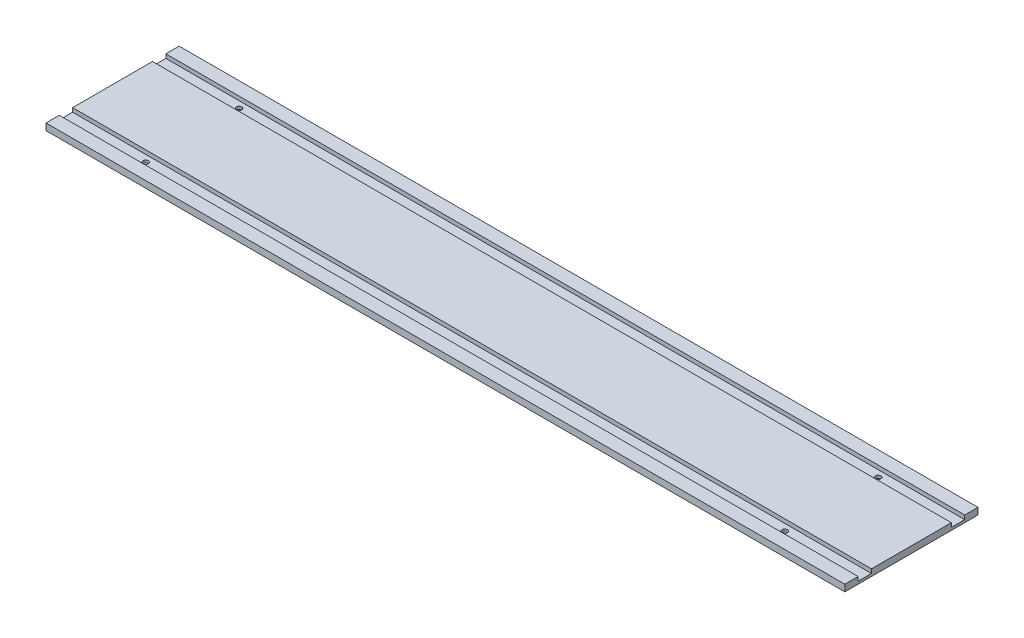
ISO-10303-21;
HEADER;
FILE_DESCRIPTION(('STEP AP214'),'2;1');
FILE_NAME('part.step','',(''),(''),'','','');
FILE_SCHEMA(('AUTOMOTIVE_DESIGN { 1 0 10303 214 1 1 1 1 }'));
ENDSEC;
DATA;
#1=APPLICATION_CONTEXT('core data for automotive mechanical design processes');
#2=APPLICATION_PROTOCOL_DEFINITION('international standard','automotive_design',2000,#1);
#3=PRODUCT_CONTEXT('',#1,'mechanical');
#4=PRODUCT('Part','Part','',(#3));
#5=PRODUCT_RELATED_PRODUCT_CATEGORY('part','',(#4));
#6=PRODUCT_DEFINITION_FORMATION('','',#4);
#7=PRODUCT_DEFINITION_CONTEXT('part definition',#1,'design');
#8=PRODUCT_DEFINITION('design','',#6,#7);
#9=PRODUCT_DEFINITION_SHAPE('','',#8);
#10=(LENGTH_UNIT() NAMED_UNIT(*) SI_UNIT(.MILLI.,.METRE.));
#11=(NAMED_UNIT(*) PLANE_ANGLE_UNIT() SI_UNIT($,.RADIAN.));
#12=(NAMED_UNIT(*) SI_UNIT($,.STERADIAN.) SOLID_ANGLE_UNIT());
#13=UNCERTAINTY_MEASURE_WITH_UNIT(LENGTH_MEASURE(1.E-05),#10,'distance_accuracy_value','');
#14=(GEOMETRIC_REPRESENTATION_CONTEXT(3) GLOBAL_UNCERTAINTY_ASSIGNED_CONTEXT((#13)) GLOBAL_UNIT_ASSIGNED_CONTEXT((#10,
#11,#12)) REPRESENTATION_CONTEXT('',''));
#15=CARTESIAN_POINT('',(0.,0.,0.));
#16=DIRECTION('',(0.,0.,1.));
#17=DIRECTION('',(1.,0.,0.));
#18=AXIS2_PLACEMENT_3D('',#15,#16,#17);
#19=CARTESIAN_POINT('',(600.,5.,-100.));
#20=DIRECTION('',(0.,1.,0.));
#21=DIRECTION('',(-1.,0.,0.));
#22=AXIS2_PLACEMENT_3D('',#19,#20,#21);
#23=PLANE('',#22);
#24=DIRECTION('',(1.,0.,0.));
#25=VECTOR('',#24,1.);
#26=CARTESIAN_POINT('',(0.,4.99999999999994,-80.));
#27=LINE('',#26,#25);
#28=CARTESIAN_POINT('',(0.,4.99999999999994,-80.));
#29=VERTEX_POINT('',#28);
#30=CARTESIAN_POINT('',(600.,5.,-80.));
#31=VERTEX_POINT('',#30);
#32=EDGE_CURVE('E149',#29,#31,#27,.T.);
#33=ORIENTED_EDGE('',*,*,#32,.F.);
#34=DIRECTION('',(0.,0.,1.));
#35=VECTOR('',#34,1.);
#36=CARTESIAN_POINT('',(0.,4.99999999999994,-100.));
#37=LINE('',#36,#35);
#38=CARTESIAN_POINT('',(0.,4.99999999999994,-20.));
#39=VERTEX_POINT('',#38);
#40=EDGE_CURVE('E48',#29,#39,#37,.T.);
#41=ORIENTED_EDGE('',*,*,#40,.T.);
#42=DIRECTION('',(-1.,0.,0.));
#43=VECTOR('',#42,1.);
#44=CARTESIAN_POINT('',(0.,4.99999999999994,-20.));
#45=LINE('',#44,#43);
#46=CARTESIAN_POINT('',(600.,5.,-20.));
#47=VERTEX_POINT('',#46);
#48=EDGE_CURVE('E178',#47,#39,#45,.T.);
#49=ORIENTED_EDGE('',*,*,#48,.F.);
#50=DIRECTION('',(0.,0.,1.));
#51=VECTOR('',#50,1.);
#52=CARTESIAN_POINT('',(600.,5.,-100.));
#53=LINE('',#52,#51);
#54=EDGE_CURVE('E232',#31,#47,#53,.T.);
#55=ORIENTED_EDGE('',*,*,#54,.F.);
#56=EDGE_LOOP('',(#33,#41,#49,#55));
#57=FACE_BOUND('',#56,.T.);
#58=ADVANCED_FACE('F38',(#57),#23,.T.);
#59=DIRECTION('',(-1.,0.,0.));
#60=VECTOR('',#59,1.);
#61=CARTESIAN_POINT('',(0.,4.99999999999994,-90.));
#62=LINE('',#61,#60);
#63=CARTESIAN_POINT('',(600.,5.,-90.));
#64=VERTEX_POINT('',#63);
#65=CARTESIAN_POINT('',(0.,4.99999999999994,-90.));
#66=VERTEX_POINT('',#65);
#67=EDGE_CURVE('E186',#64,#66,#62,.T.);
#68=ORIENTED_EDGE('',*,*,#67,.F.);
#69=CARTESIAN_POINT('',(600.,5.,-100.));
#70=VERTEX_POINT('',#69);
#71=EDGE_CURVE('E154',#70,#64,#53,.T.);
#72=ORIENTED_EDGE('',*,*,#71,.F.);
#73=DIRECTION('',(-1.,0.,0.));
#74=VECTOR('',#73,1.);
#75=CARTESIAN_POINT('',(600.,5.,-100.));
#76=LINE('',#75,#74);
#77=CARTESIAN_POINT('',(0.,4.99999999999994,-100.));
#78=VERTEX_POINT('',#77);
#79=EDGE_CURVE('E209',#70,#78,#76,.T.);
#80=ORIENTED_EDGE('',*,*,#79,.T.);
#81=EDGE_CURVE('E11',#78,#66,#37,.T.);
#82=ORIENTED_EDGE('',*,*,#81,.T.);
#83=EDGE_LOOP('',(#68,#72,#80,#82));
#84=FACE_BOUND('',#83,.T.);
#85=ADVANCED_FACE('F272',(#84),#23,.T.);
#86=CARTESIAN_POINT('',(0.,4.99999999999994,-100.));
#87=DIRECTION('',(-1.,0.,0.));
#88=DIRECTION('',(0.,-1.,0.));
#89=AXIS2_PLACEMENT_3D('',#86,#87,#88);
#90=PLANE('',#89);
#91=DIRECTION('',(0.,1.,0.));
#92=VECTOR('',#91,1.);
#93=CARTESIAN_POINT('',(0.,1.99999999999993,-80.));
#94=LINE('',#93,#92);
#95=CARTESIAN_POINT('',(0.,1.99999999999993,-80.));
#96=VERTEX_POINT('',#95);
#97=EDGE_CURVE('E159',#96,#29,#94,.T.);
#98=ORIENTED_EDGE('',*,*,#97,.F.);
#99=DIRECTION('',(0.,0.,1.));
#100=VECTOR('',#99,1.);
#101=CARTESIAN_POINT('',(0.,1.99999999999993,-90.));
#102=LINE('',#101,#100);
#103=CARTESIAN_POINT('',(0.,1.99999999999993,-90.));
#104=VERTEX_POINT('',#103);
#105=EDGE_CURVE('E141',#104,#96,#102,.T.);
#106=ORIENTED_EDGE('',*,*,#105,.F.);
#107=DIRECTION('',(0.,1.,0.));
#108=VECTOR('',#107,1.);
#109=CARTESIAN_POINT('',(0.,1.99999999999993,-90.));
#110=LINE('',#109,#108);
#111=EDGE_CURVE('E138',#104,#66,#110,.T.);
#112=ORIENTED_EDGE('',*,*,#111,.T.);
#113=ORIENTED_EDGE('',*,*,#81,.F.);
#114=DIRECTION('',(0.,-1.,0.));
#115=VECTOR('',#114,1.);
#116=CARTESIAN_POINT('',(0.,4.99999999999994,-100.));
#117=LINE('',#116,#115);
#118=CARTESIAN_POINT('',(0.,0.,-100.));
#119=VERTEX_POINT('',#118);
#120=EDGE_CURVE('E197',#78,#119,#117,.T.);
#121=ORIENTED_EDGE('',*,*,#120,.T.);
#122=DIRECTION('',(0.,0.,1.));
#123=VECTOR('',#122,1.);
#124=CARTESIAN_POINT('',(0.,0.,-100.));
#125=LINE('',#124,#123);
#126=CARTESIAN_POINT('',(0.,0.,0.));
#127=VERTEX_POINT('',#126);
#128=EDGE_CURVE('E213',#119,#127,#125,.T.);
#129=ORIENTED_EDGE('',*,*,#128,.T.);
#130=DIRECTION('',(0.,-1.,0.));
#131=VECTOR('',#130,1.);
#132=CARTESIAN_POINT('',(0.,4.99999999999994,0.));
#133=LINE('',#132,#131);
#134=CARTESIAN_POINT('',(0.,4.99999999999994,0.));
#135=VERTEX_POINT('',#134);
#136=EDGE_CURVE('E214',#135,#127,#133,.T.);
#137=ORIENTED_EDGE('',*,*,#136,.F.);
#138=CARTESIAN_POINT('',(0.,4.99999999999994,-10.));
#139=VERTEX_POINT('',#138);
#140=EDGE_CURVE('E50',#139,#135,#37,.T.);
#141=ORIENTED_EDGE('',*,*,#140,.F.);
#142=DIRECTION('',(0.,1.,0.));
#143=VECTOR('',#142,1.);
#144=CARTESIAN_POINT('',(0.,1.99999999999993,-10.));
#145=LINE('',#144,#143);
#146=CARTESIAN_POINT('',(0.,1.99999999999993,-10.));
#147=VERTEX_POINT('',#146);
#148=EDGE_CURVE('E191',#147,#139,#145,.T.);
#149=ORIENTED_EDGE('',*,*,#148,.F.);
#150=DIRECTION('',(0.,0.,1.));
#151=VECTOR('',#150,1.);
#152=CARTESIAN_POINT('',(0.,1.99999999999993,-20.));
#153=LINE('',#152,#151);
#154=CARTESIAN_POINT('',(0.,1.99999999999993,-20.));
#155=VERTEX_POINT('',#154);
#156=EDGE_CURVE('E168',#155,#147,#153,.T.);
#157=ORIENTED_EDGE('',*,*,#156,.F.);
#158=DIRECTION('',(0.,1.,0.));
#159=VECTOR('',#158,1.);
#160=CARTESIAN_POINT('',(0.,1.99999999999993,-20.));
#161=LINE('',#160,#159);
#162=EDGE_CURVE('E177',#155,#39,#161,.T.);
#163=ORIENTED_EDGE('',*,*,#162,.T.);
#164=ORIENTED_EDGE('',*,*,#40,.F.);
#165=EDGE_LOOP('',(#98,#106,#112,#113,#121,#129,#137,#141,#149,#157,#163,#164));
#166=FACE_BOUND('',#165,.T.);
#167=ADVANCED_FACE('F40',(#166),#90,.T.);
#168=DIRECTION('',(1.,0.,0.));
#169=VECTOR('',#168,1.);
#170=CARTESIAN_POINT('',(0.,4.99999999999994,-10.));
#171=LINE('',#170,#169);
#172=CARTESIAN_POINT('',(600.,5.,-10.));
#173=VERTEX_POINT('',#172);
#174=EDGE_CURVE('E169',#139,#173,#171,.T.);
#175=ORIENTED_EDGE('',*,*,#174,.F.);
#176=ORIENTED_EDGE('',*,*,#140,.T.);
#177=DIRECTION('',(-1.,0.,0.));
#178=VECTOR('',#177,1.);
#179=CARTESIAN_POINT('',(600.,5.,0.));
#180=LINE('',#179,#178);
#181=CARTESIAN_POINT('',(600.,5.,0.));
#182=VERTEX_POINT('',#181);
#183=EDGE_CURVE('E202',#182,#135,#180,.T.);
#184=ORIENTED_EDGE('',*,*,#183,.F.);
#185=EDGE_CURVE('E233',#173,#182,#53,.T.);
#186=ORIENTED_EDGE('',*,*,#185,.F.);
#187=EDGE_LOOP('',(#175,#176,#184,#186));
#188=FACE_BOUND('',#187,.T.);
#189=ADVANCED_FACE('F275',(#188),#23,.T.);
#190=CARTESIAN_POINT('',(600.,0.,-100.));
#191=DIRECTION('',(1.,0.,0.));
#192=DIRECTION('',(0.,0.,-1.));
#193=AXIS2_PLACEMENT_3D('',#190,#191,#192);
#194=PLANE('',#193);
#195=DIRECTION('',(0.,1.,0.));
#196=VECTOR('',#195,1.);
#197=CARTESIAN_POINT('',(600.,2.,-80.));
#198=LINE('',#197,#196);
#199=CARTESIAN_POINT('',(600.,2.,-80.));
#200=VERTEX_POINT('',#199);
#201=EDGE_CURVE('E219',#200,#31,#198,.T.);
#202=ORIENTED_EDGE('',*,*,#201,.T.);
#203=ORIENTED_EDGE('',*,*,#54,.T.);
#204=DIRECTION('',(0.,1.,0.));
#205=VECTOR('',#204,1.);
#206=CARTESIAN_POINT('',(600.,2.,-20.));
#207=LINE('',#206,#205);
#208=CARTESIAN_POINT('',(600.,2.,-20.));
#209=VERTEX_POINT('',#208);
#210=EDGE_CURVE('E183',#209,#47,#207,.T.);
#211=ORIENTED_EDGE('',*,*,#210,.F.);
#212=DIRECTION('',(0.,0.,-1.));
#213=VECTOR('',#212,1.);
#214=CARTESIAN_POINT('',(600.,2.,-20.));
#215=LINE('',#214,#213);
#216=CARTESIAN_POINT('',(600.,2.,-9.99999999999999));
#217=VERTEX_POINT('',#216);
#218=EDGE_CURVE('E174',#217,#209,#215,.T.);
#219=ORIENTED_EDGE('',*,*,#218,.F.);
#220=DIRECTION('',(0.,1.,0.));
#221=VECTOR('',#220,1.);
#222=CARTESIAN_POINT('',(600.,2.,-10.));
#223=LINE('',#222,#221);
#224=EDGE_CURVE('E187',#217,#173,#223,.T.);
#225=ORIENTED_EDGE('',*,*,#224,.T.);
#226=ORIENTED_EDGE('',*,*,#185,.T.);
#227=DIRECTION('',(0.,1.,0.));
#228=VECTOR('',#227,1.);
#229=CARTESIAN_POINT('',(600.,0.,0.));
#230=LINE('',#229,#228);
#231=CARTESIAN_POINT('',(600.,0.,0.));
#232=VERTEX_POINT('',#231);
#233=EDGE_CURVE('E223',#232,#182,#230,.T.);
#234=ORIENTED_EDGE('',*,*,#233,.F.);
#235=DIRECTION('',(0.,0.,1.));
#236=VECTOR('',#235,1.);
#237=CARTESIAN_POINT('',(600.,0.,-100.));
#238=LINE('',#237,#236);
#239=CARTESIAN_POINT('',(600.,0.,-100.));
#240=VERTEX_POINT('',#239);
#241=EDGE_CURVE('E234',#240,#232,#238,.T.);
#242=ORIENTED_EDGE('',*,*,#241,.F.);
#243=DIRECTION('',(0.,1.,0.));
#244=VECTOR('',#243,1.);
#245=CARTESIAN_POINT('',(600.,0.,-100.));
#246=LINE('',#245,#244);
#247=EDGE_CURVE('E206',#240,#70,#246,.T.);
#248=ORIENTED_EDGE('',*,*,#247,.T.);
#249=ORIENTED_EDGE('',*,*,#71,.T.);
#250=DIRECTION('',(0.,1.,0.));
#251=VECTOR('',#250,1.);
#252=CARTESIAN_POINT('',(600.,2.,-90.));
#253=LINE('',#252,#251);
#254=CARTESIAN_POINT('',(600.,2.,-90.));
#255=VERTEX_POINT('',#254);
#256=EDGE_CURVE('E135',#255,#64,#253,.T.);
#257=ORIENTED_EDGE('',*,*,#256,.F.);
#258=DIRECTION('',(0.,0.,-1.));
#259=VECTOR('',#258,1.);
#260=CARTESIAN_POINT('',(600.,2.,-90.));
#261=LINE('',#260,#259);
#262=EDGE_CURVE('E142',#200,#255,#261,.T.);
#263=ORIENTED_EDGE('',*,*,#262,.F.);
#264=EDGE_LOOP('',(#202,#203,#211,#219,#225,#226,#234,#242,#248,#249,#257,#263));
#265=FACE_BOUND('',#264,.T.);
#266=ADVANCED_FACE('F152',(#265),#194,.T.);
#267=CARTESIAN_POINT('',(0.,0.,-100.));
#268=DIRECTION('',(0.,-1.,0.));
#269=DIRECTION('',(0.,0.,-1.));
#270=AXIS2_PLACEMENT_3D('',#267,#268,#269);
#271=PLANE('',#270);
#272=CARTESIAN_POINT('',(60.,0.,-15.));
#273=DIRECTION('',(0.,1.,0.));
#274=DIRECTION('',(-1.,0.,0.));
#275=AXIS2_PLACEMENT_3D('',#272,#273,#274);
#276=CIRCLE('',#275,2.);
#277=CARTESIAN_POINT('',(58.,0.,-15.));
#278=VERTEX_POINT('',#277);
#279=EDGE_CURVE('E429',#278,#278,#276,.T.);
#280=ORIENTED_EDGE('',*,*,#279,.T.);
#281=EDGE_LOOP('',(#280));
#282=FACE_BOUND('',#281,.T.);
#283=CARTESIAN_POINT('',(540.,0.,-85.));
#284=DIRECTION('',(0.,1.,0.));
#285=DIRECTION('',(-1.,0.,0.));
#286=AXIS2_PLACEMENT_3D('',#283,#284,#285);
#287=CIRCLE('',#286,2.);
#288=CARTESIAN_POINT('',(538.,0.,-85.));
#289=VERTEX_POINT('',#288);
#290=EDGE_CURVE('E426',#289,#289,#287,.T.);
#291=ORIENTED_EDGE('',*,*,#290,.T.);
#292=EDGE_LOOP('',(#291));
#293=FACE_BOUND('',#292,.T.);
#294=CARTESIAN_POINT('',(540.,0.,-15.));
#295=DIRECTION('',(0.,1.,0.));
#296=DIRECTION('',(-1.,0.,0.));
#297=AXIS2_PLACEMENT_3D('',#294,#295,#296);
#298=CIRCLE('',#297,2.);
#299=CARTESIAN_POINT('',(538.,0.,-15.));
#300=VERTEX_POINT('',#299);
#301=EDGE_CURVE('E430',#300,#300,#298,.T.);
#302=ORIENTED_EDGE('',*,*,#301,.T.);
#303=EDGE_LOOP('',(#302));
#304=FACE_BOUND('',#303,.T.);
#305=CARTESIAN_POINT('',(60.,0.,-85.));
#306=DIRECTION('',(0.,1.,0.));
#307=DIRECTION('',(-1.,0.,0.));
#308=AXIS2_PLACEMENT_3D('',#305,#306,#307);
#309=CIRCLE('',#308,2.);
#310=CARTESIAN_POINT('',(58.,0.,-85.));
#311=VERTEX_POINT('',#310);
#312=EDGE_CURVE('E244',#311,#311,#309,.T.);
#313=ORIENTED_EDGE('',*,*,#312,.T.);
#314=EDGE_LOOP('',(#313));
#315=FACE_BOUND('',#314,.T.);
#316=DIRECTION('',(1.,0.,0.));
#317=VECTOR('',#316,1.);
#318=CARTESIAN_POINT('',(0.,0.,0.));
#319=LINE('',#318,#317);
#320=EDGE_CURVE('E218',#127,#232,#319,.T.);
#321=ORIENTED_EDGE('',*,*,#320,.F.);
#322=ORIENTED_EDGE('',*,*,#128,.F.);
#323=DIRECTION('',(1.,0.,0.));
#324=VECTOR('',#323,1.);
#325=CARTESIAN_POINT('',(0.,0.,-100.));
#326=LINE('',#325,#324);
#327=EDGE_CURVE('E201',#119,#240,#326,.T.);
#328=ORIENTED_EDGE('',*,*,#327,.T.);
#329=ORIENTED_EDGE('',*,*,#241,.T.);
#330=EDGE_LOOP('',(#321,#322,#328,#329));
#331=FACE_BOUND('',#330,.T.);
#332=ADVANCED_FACE('F290',(#282,#293,#304,#315,#331),#271,.T.);
#333=CARTESIAN_POINT('',(0.,0.,-100.));
#334=DIRECTION('',(0.,0.,1.));
#335=DIRECTION('',(1.,0.,0.));
#336=AXIS2_PLACEMENT_3D('',#333,#334,#335);
#337=PLANE('',#336);
#338=ORIENTED_EDGE('',*,*,#120,.F.);
#339=ORIENTED_EDGE('',*,*,#79,.F.);
#340=ORIENTED_EDGE('',*,*,#247,.F.);
#341=ORIENTED_EDGE('',*,*,#327,.F.);
#342=EDGE_LOOP('',(#338,#339,#340,#341));
#343=FACE_BOUND('',#342,.T.);
#344=ADVANCED_FACE('F324',(#343),#337,.F.);
#345=CARTESIAN_POINT('',(0.,0.,0.));
#346=DIRECTION('',(0.,0.,1.));
#347=DIRECTION('',(1.,0.,0.));
#348=AXIS2_PLACEMENT_3D('',#345,#346,#347);
#349=PLANE('',#348);
#350=ORIENTED_EDGE('',*,*,#136,.T.);
#351=ORIENTED_EDGE('',*,*,#320,.T.);
#352=ORIENTED_EDGE('',*,*,#233,.T.);
#353=ORIENTED_EDGE('',*,*,#183,.T.);
#354=EDGE_LOOP('',(#350,#351,#352,#353));
#355=FACE_BOUND('',#354,.T.);
#356=ADVANCED_FACE('F316',(#355),#349,.T.);
#357=CARTESIAN_POINT('',(0.,1.99999999999993,-20.));
#358=DIRECTION('',(0.,0.,-1.));
#359=DIRECTION('',(-1.,0.,0.));
#360=AXIS2_PLACEMENT_3D('',#357,#358,#359);
#361=PLANE('',#360);
#362=ORIENTED_EDGE('',*,*,#48,.T.);
#363=ORIENTED_EDGE('',*,*,#162,.F.);
#364=DIRECTION('',(-1.,0.,0.));
#365=VECTOR('',#364,1.);
#366=CARTESIAN_POINT('',(0.,1.99999999999993,-20.));
#367=LINE('',#366,#365);
#368=EDGE_CURVE('E164',#209,#155,#367,.T.);
#369=ORIENTED_EDGE('',*,*,#368,.F.);
#370=ORIENTED_EDGE('',*,*,#210,.T.);
#371=EDGE_LOOP('',(#362,#363,#369,#370));
#372=FACE_BOUND('',#371,.T.);
#373=ADVANCED_FACE('F309',(#372),#361,.F.);
#374=CARTESIAN_POINT('',(0.,1.99999999999993,-10.));
#375=DIRECTION('',(0.,0.,1.));
#376=DIRECTION('',(1.,0.,0.));
#377=AXIS2_PLACEMENT_3D('',#374,#375,#376);
#378=PLANE('',#377);
#379=ORIENTED_EDGE('',*,*,#174,.T.);
#380=ORIENTED_EDGE('',*,*,#224,.F.);
#381=DIRECTION('',(1.,0.,0.));
#382=VECTOR('',#381,1.);
#383=CARTESIAN_POINT('',(0.,1.99999999999993,-10.));
#384=LINE('',#383,#382);
#385=EDGE_CURVE('E65',#147,#217,#384,.T.);
#386=ORIENTED_EDGE('',*,*,#385,.F.);
#387=ORIENTED_EDGE('',*,*,#148,.T.);
#388=EDGE_LOOP('',(#379,#380,#386,#387));
#389=FACE_BOUND('',#388,.T.);
#390=ADVANCED_FACE('F342',(#389),#378,.F.);
#391=CARTESIAN_POINT('',(0.,1.99999999999993,0.));
#392=DIRECTION('',(0.,-1.,0.));
#393=DIRECTION('',(1.,0.,0.));
#394=AXIS2_PLACEMENT_3D('',#391,#392,#393);
#395=PLANE('',#394);
#396=CARTESIAN_POINT('',(60.,1.99999999999994,-15.));
#397=DIRECTION('',(0.,-1.,0.));
#398=DIRECTION('',(1.,0.,0.));
#399=AXIS2_PLACEMENT_3D('',#396,#397,#398);
#400=CIRCLE('',#399,2.);
#401=CARTESIAN_POINT('',(58.,1.99999999999994,-15.));
#402=VERTEX_POINT('',#401);
#403=EDGE_CURVE('E42',#402,#402,#400,.T.);
#404=ORIENTED_EDGE('',*,*,#403,.T.);
#405=EDGE_LOOP('',(#404));
#406=FACE_BOUND('',#405,.T.);
#407=CARTESIAN_POINT('',(540.,1.99999999999999,-15.));
#408=DIRECTION('',(0.,-1.,0.));
#409=DIRECTION('',(1.,0.,0.));
#410=AXIS2_PLACEMENT_3D('',#407,#408,#409);
#411=CIRCLE('',#410,2.);
#412=CARTESIAN_POINT('',(538.,1.99999999999999,-15.));
#413=VERTEX_POINT('',#412);
#414=EDGE_CURVE('E247',#413,#413,#411,.T.);
#415=ORIENTED_EDGE('',*,*,#414,.T.);
#416=EDGE_LOOP('',(#415));
#417=FACE_BOUND('',#416,.T.);
#418=ORIENTED_EDGE('',*,*,#368,.T.);
#419=ORIENTED_EDGE('',*,*,#156,.T.);
#420=ORIENTED_EDGE('',*,*,#385,.T.);
#421=ORIENTED_EDGE('',*,*,#218,.T.);
#422=EDGE_LOOP('',(#418,#419,#420,#421));
#423=FACE_BOUND('',#422,.T.);
#424=ADVANCED_FACE('F256',(#406,#417,#423),#395,.F.);
#425=CARTESIAN_POINT('',(0.,1.99999999999993,-80.));
#426=DIRECTION('',(0.,0.,1.));
#427=DIRECTION('',(1.,0.,0.));
#428=AXIS2_PLACEMENT_3D('',#425,#426,#427);
#429=PLANE('',#428);
#430=ORIENTED_EDGE('',*,*,#32,.T.);
#431=ORIENTED_EDGE('',*,*,#201,.F.);
#432=DIRECTION('',(1.,0.,0.));
#433=VECTOR('',#432,1.);
#434=CARTESIAN_POINT('',(0.,1.99999999999993,-80.));
#435=LINE('',#434,#433);
#436=EDGE_CURVE('E57',#96,#200,#435,.T.);
#437=ORIENTED_EDGE('',*,*,#436,.F.);
#438=ORIENTED_EDGE('',*,*,#97,.T.);
#439=EDGE_LOOP('',(#430,#431,#437,#438));
#440=FACE_BOUND('',#439,.T.);
#441=ADVANCED_FACE('F334',(#440),#429,.F.);
#442=CARTESIAN_POINT('',(0.,1.99999999999993,-90.));
#443=DIRECTION('',(0.,0.,-1.));
#444=DIRECTION('',(-1.,0.,0.));
#445=AXIS2_PLACEMENT_3D('',#442,#443,#444);
#446=PLANE('',#445);
#447=ORIENTED_EDGE('',*,*,#67,.T.);
#448=ORIENTED_EDGE('',*,*,#111,.F.);
#449=DIRECTION('',(-1.,0.,0.));
#450=VECTOR('',#449,1.);
#451=CARTESIAN_POINT('',(0.,1.99999999999993,-90.));
#452=LINE('',#451,#450);
#453=EDGE_CURVE('E132',#255,#104,#452,.T.);
#454=ORIENTED_EDGE('',*,*,#453,.F.);
#455=ORIENTED_EDGE('',*,*,#256,.T.);
#456=EDGE_LOOP('',(#447,#448,#454,#455));
#457=FACE_BOUND('',#456,.T.);
#458=ADVANCED_FACE('F133',(#457),#446,.F.);
#459=CARTESIAN_POINT('',(0.,1.99999999999993,0.));
#460=DIRECTION('',(0.,1.,0.));
#461=DIRECTION('',(-1.,0.,0.));
#462=AXIS2_PLACEMENT_3D('',#459,#460,#461);
#463=PLANE('',#462);
#464=CARTESIAN_POINT('',(540.,1.99999999999999,-85.));
#465=DIRECTION('',(0.,1.,0.));
#466=DIRECTION('',(-1.,0.,0.));
#467=AXIS2_PLACEMENT_3D('',#464,#465,#466);
#468=CIRCLE('',#467,2.);
#469=CARTESIAN_POINT('',(538.,1.99999999999999,-85.));
#470=VERTEX_POINT('',#469);
#471=EDGE_CURVE('E243',#470,#470,#468,.T.);
#472=ORIENTED_EDGE('',*,*,#471,.F.);
#473=EDGE_LOOP('',(#472));
#474=FACE_BOUND('',#473,.T.);
#475=CARTESIAN_POINT('',(60.,1.99999999999994,-85.));
#476=DIRECTION('',(0.,1.,0.));
#477=DIRECTION('',(-1.,0.,0.));
#478=AXIS2_PLACEMENT_3D('',#475,#476,#477);
#479=CIRCLE('',#478,2.);
#480=CARTESIAN_POINT('',(58.,1.99999999999994,-85.));
#481=VERTEX_POINT('',#480);
#482=EDGE_CURVE('E239',#481,#481,#479,.T.);
#483=ORIENTED_EDGE('',*,*,#482,.F.);
#484=EDGE_LOOP('',(#483));
#485=FACE_BOUND('',#484,.T.);
#486=ORIENTED_EDGE('',*,*,#262,.T.);
#487=ORIENTED_EDGE('',*,*,#453,.T.);
#488=ORIENTED_EDGE('',*,*,#105,.T.);
#489=ORIENTED_EDGE('',*,*,#436,.T.);
#490=EDGE_LOOP('',(#486,#487,#488,#489));
#491=FACE_BOUND('',#490,.T.);
#492=ADVANCED_FACE('F145',(#474,#485,#491),#463,.T.);
#493=CARTESIAN_POINT('',(60.,0.,-85.));
#494=DIRECTION('',(0.,1.,0.));
#495=DIRECTION('',(-1.,0.,0.));
#496=AXIS2_PLACEMENT_3D('',#493,#494,#495);
#497=CYLINDRICAL_SURFACE('',#496,2.);
#498=CARTESIAN_POINT('',(58.,1.99999999999994,-85.));
#499=CARTESIAN_POINT('',(58.,1.97916666666661,-85.));
#500=CARTESIAN_POINT('',(58.,1.95833333333327,-85.));
#501=CARTESIAN_POINT('',(58.,1.91666666666661,-85.));
#502=CARTESIAN_POINT('',(58.,1.89583333333327,-85.));
#503=CARTESIAN_POINT('',(58.,1.85416666666661,-85.));
#504=CARTESIAN_POINT('',(58.,1.83333333333327,-85.));
#505=CARTESIAN_POINT('',(58.,1.79166666666661,-85.));
#506=CARTESIAN_POINT('',(58.,1.77083333333327,-85.));
#507=CARTESIAN_POINT('',(58.,1.72916666666661,-85.));
#508=CARTESIAN_POINT('',(58.,1.70833333333327,-85.));
#509=CARTESIAN_POINT('',(58.,1.66666666666661,-85.));
#510=CARTESIAN_POINT('',(58.,1.64583333333327,-85.));
#511=CARTESIAN_POINT('',(58.,1.60416666666661,-85.));
#512=CARTESIAN_POINT('',(58.,1.58333333333327,-85.));
#513=CARTESIAN_POINT('',(58.,1.54166666666661,-85.));
#514=CARTESIAN_POINT('',(58.,1.52083333333327,-85.));
#515=CARTESIAN_POINT('',(58.,1.47916666666661,-85.));
#516=CARTESIAN_POINT('',(58.,1.45833333333327,-85.));
#517=CARTESIAN_POINT('',(58.,1.41666666666661,-85.));
#518=CARTESIAN_POINT('',(58.,1.39583333333327,-85.));
#519=CARTESIAN_POINT('',(58.,1.35416666666661,-85.));
#520=CARTESIAN_POINT('',(58.,1.33333333333327,-85.));
#521=CARTESIAN_POINT('',(58.,1.29166666666661,-85.));
#522=CARTESIAN_POINT('',(58.,1.27083333333327,-85.));
#523=CARTESIAN_POINT('',(58.,1.22916666666661,-85.));
#524=CARTESIAN_POINT('',(58.,1.20833333333327,-85.));
#525=CARTESIAN_POINT('',(58.,1.16666666666661,-85.));
#526=CARTESIAN_POINT('',(58.,1.14583333333327,-85.));
#527=CARTESIAN_POINT('',(58.,1.10416666666661,-85.));
#528=CARTESIAN_POINT('',(58.,1.08333333333327,-85.));
#529=CARTESIAN_POINT('',(58.,1.04166666666661,-85.));
#530=CARTESIAN_POINT('',(58.,1.02083333333327,-85.));
#531=CARTESIAN_POINT('',(58.,0.979166666666607,-85.));
#532=CARTESIAN_POINT('',(58.,0.958333333333274,-85.));
#533=CARTESIAN_POINT('',(58.,0.916666666666607,-85.));
#534=CARTESIAN_POINT('',(58.,0.895833333333274,-85.));
#535=CARTESIAN_POINT('',(58.,0.854166666666607,-85.));
#536=CARTESIAN_POINT('',(58.,0.833333333333274,-85.));
#537=CARTESIAN_POINT('',(58.,0.791666666666607,-85.));
#538=CARTESIAN_POINT('',(58.,0.770833333333274,-85.));
#539=CARTESIAN_POINT('',(58.,0.729166666666607,-85.));
#540=CARTESIAN_POINT('',(58.,0.708333333333274,-85.));
#541=CARTESIAN_POINT('',(58.,0.666666666666607,-85.));
#542=CARTESIAN_POINT('',(58.,0.645833333333274,-85.));
#543=CARTESIAN_POINT('',(58.,0.604166666666607,-85.));
#544=CARTESIAN_POINT('',(58.,0.583333333333274,-85.));
#545=CARTESIAN_POINT('',(58.,0.541666666666607,-85.));
#546=CARTESIAN_POINT('',(58.,0.520833333333274,-85.));
#547=CARTESIAN_POINT('',(58.,0.479166666666607,-85.));
#548=CARTESIAN_POINT('',(58.,0.458333333333274,-85.));
#549=CARTESIAN_POINT('',(58.,0.416666666666607,-85.));
#550=CARTESIAN_POINT('',(58.,0.395833333333274,-85.));
#551=CARTESIAN_POINT('',(58.,0.354166666666607,-85.));
#552=CARTESIAN_POINT('',(58.,0.333333333333274,-85.));
#553=CARTESIAN_POINT('',(58.,0.291666666666607,-85.));
#554=CARTESIAN_POINT('',(58.,0.270833333333273,-85.));
#555=CARTESIAN_POINT('',(58.,0.229166666666607,-85.));
#556=CARTESIAN_POINT('',(58.,0.208333333333273,-85.));
#557=CARTESIAN_POINT('',(58.,0.166666666666607,-85.));
#558=CARTESIAN_POINT('',(58.,0.145833333333273,-85.));
#559=CARTESIAN_POINT('',(58.,0.104166666666607,-85.));
#560=CARTESIAN_POINT('',(58.,0.0833333333332733,-85.));
#561=CARTESIAN_POINT('',(58.,0.0416666666666066,-85.));
#562=CARTESIAN_POINT('',(58.,0.0208333333332733,-85.));
#563=CARTESIAN_POINT('',(58.,0.,-85.));
#564=B_SPLINE_CURVE_WITH_KNOTS('',3,(#498,#499,#500,#501,#502,#503,#504,#505,#506,#507,#508,
#509,#510,#511,#512,#513,#514,#515,#516,#517,#518,#519,#520,#521,#522,#523,#524,#525,#526,#527,
#528,#529,#530,#531,#532,#533,#534,#535,#536,#537,#538,#539,#540,#541,#542,#543,#544,#545,#546,
#547,#548,#549,#550,#551,#552,#553,#554,#555,#556,#557,#558,#559,#560,#561,#562,#563),
.UNSPECIFIED.,.F.,.F.,(4,2,2,2,2,2,2,2,2,2,2,2,2,2,2,2,2,2,2,2,2,2,2,2,2,2,2,2,2,2,2,2,4),(0.,
0.0624999999999996,0.125,0.1875,0.25,0.3125,0.375,0.4375,0.5,0.5625,0.625,0.6875,0.75,0.8125,
0.875,0.9375,1.,1.0625,1.125,1.1875,1.25,1.3125,1.375,1.4375,1.5,1.5625,1.625,1.6875,1.75,
1.8125,1.875,1.9375,2.),.UNSPECIFIED.);
#565=EDGE_CURVE('BSEAM391',#481,#311,#564,.T.);
#566=ORIENTED_EDGE('',*,*,#482,.T.);
#567=ORIENTED_EDGE('',*,*,#312,.F.);
#568=ORIENTED_EDGE('',*,*,#565,.T.);
#569=ORIENTED_EDGE('',*,*,#565,.F.);
#570=EDGE_LOOP('',(#566,#568,#567,#569));
#571=FACE_BOUND('',#570,.T.);
#572=ADVANCED_FACE('F391',(#571),#497,.F.);
#573=CARTESIAN_POINT('',(540.,0.,-85.));
#574=DIRECTION('',(0.,1.,0.));
#575=DIRECTION('',(-1.,0.,0.));
#576=AXIS2_PLACEMENT_3D('',#573,#574,#575);
#577=CYLINDRICAL_SURFACE('',#576,2.);
#578=CARTESIAN_POINT('',(538.,1.99999999999999,-85.));
#579=CARTESIAN_POINT('',(538.,1.97916666666666,-85.));
#580=CARTESIAN_POINT('',(538.,1.95833333333333,-85.));
#581=CARTESIAN_POINT('',(538.,1.91666666666666,-85.));
#582=CARTESIAN_POINT('',(538.,1.89583333333333,-85.));
#583=CARTESIAN_POINT('',(538.,1.85416666666666,-85.));
#584=CARTESIAN_POINT('',(538.,1.83333333333333,-85.));
#585=CARTESIAN_POINT('',(538.,1.79166666666666,-85.));
#586=CARTESIAN_POINT('',(538.,1.77083333333333,-85.));
#587=CARTESIAN_POINT('',(538.,1.72916666666666,-85.));
#588=CARTESIAN_POINT('',(538.,1.70833333333333,-85.));
#589=CARTESIAN_POINT('',(538.,1.66666666666666,-85.));
#590=CARTESIAN_POINT('',(538.,1.64583333333333,-85.));
#591=CARTESIAN_POINT('',(538.,1.60416666666666,-85.));
#592=CARTESIAN_POINT('',(538.,1.58333333333333,-85.));
#593=CARTESIAN_POINT('',(538.,1.54166666666666,-85.));
#594=CARTESIAN_POINT('',(538.,1.52083333333333,-85.));
#595=CARTESIAN_POINT('',(538.,1.47916666666666,-85.));
#596=CARTESIAN_POINT('',(538.,1.45833333333333,-85.));
#597=CARTESIAN_POINT('',(538.,1.41666666666666,-85.));
#598=CARTESIAN_POINT('',(538.,1.39583333333333,-85.));
#599=CARTESIAN_POINT('',(538.,1.35416666666666,-85.));
#600=CARTESIAN_POINT('',(538.,1.33333333333333,-85.));
#601=CARTESIAN_POINT('',(538.,1.29166666666666,-85.));
#602=CARTESIAN_POINT('',(538.,1.27083333333333,-85.));
#603=CARTESIAN_POINT('',(538.,1.22916666666666,-85.));
#604=CARTESIAN_POINT('',(538.,1.20833333333333,-85.));
#605=CARTESIAN_POINT('',(538.,1.16666666666666,-85.));
#606=CARTESIAN_POINT('',(538.,1.14583333333333,-85.));
#607=CARTESIAN_POINT('',(538.,1.10416666666666,-85.));
#608=CARTESIAN_POINT('',(538.,1.08333333333333,-85.));
#609=CARTESIAN_POINT('',(538.,1.04166666666666,-85.));
#610=CARTESIAN_POINT('',(538.,1.02083333333333,-85.));
#611=CARTESIAN_POINT('',(538.,0.97916666666666,-85.));
#612=CARTESIAN_POINT('',(538.,0.958333333333326,-85.));
#613=CARTESIAN_POINT('',(538.,0.91666666666666,-85.));
#614=CARTESIAN_POINT('',(538.,0.895833333333326,-85.));
#615=CARTESIAN_POINT('',(538.,0.85416666666666,-85.));
#616=CARTESIAN_POINT('',(538.,0.833333333333326,-85.));
#617=CARTESIAN_POINT('',(538.,0.79166666666666,-85.));
#618=CARTESIAN_POINT('',(538.,0.770833333333326,-85.));
#619=CARTESIAN_POINT('',(538.,0.72916666666666,-85.));
#620=CARTESIAN_POINT('',(538.,0.708333333333326,-85.));
#621=CARTESIAN_POINT('',(538.,0.666666666666659,-85.));
#622=CARTESIAN_POINT('',(538.,0.645833333333326,-85.));
#623=CARTESIAN_POINT('',(538.,0.604166666666659,-85.));
#624=CARTESIAN_POINT('',(538.,0.583333333333326,-85.));
#625=CARTESIAN_POINT('',(538.,0.541666666666659,-85.));
#626=CARTESIAN_POINT('',(538.,0.520833333333326,-85.));
#627=CARTESIAN_POINT('',(538.,0.479166666666659,-85.));
#628=CARTESIAN_POINT('',(538.,0.458333333333326,-85.));
#629=CARTESIAN_POINT('',(538.,0.416666666666659,-85.));
#630=CARTESIAN_POINT('',(538.,0.395833333333326,-85.));
#631=CARTESIAN_POINT('',(538.,0.354166666666659,-85.));
#632=CARTESIAN_POINT('',(538.,0.333333333333326,-85.));
#633=CARTESIAN_POINT('',(538.,0.291666666666659,-85.));
#634=CARTESIAN_POINT('',(538.,0.270833333333326,-85.));
#635=CARTESIAN_POINT('',(538.,0.229166666666659,-85.));
#636=CARTESIAN_POINT('',(538.,0.208333333333325,-85.));
#637=CARTESIAN_POINT('',(538.,0.166666666666659,-85.));
#638=CARTESIAN_POINT('',(538.,0.145833333333325,-85.));
#639=CARTESIAN_POINT('',(538.,0.104166666666659,-85.));
#640=CARTESIAN_POINT('',(538.,0.0833333333333254,-85.));
#641=CARTESIAN_POINT('',(538.,0.0416666666666587,-85.));
#642=CARTESIAN_POINT('',(538.,0.0208333333333253,-85.));
#643=CARTESIAN_POINT('',(538.,0.,-85.));
#644=B_SPLINE_CURVE_WITH_KNOTS('',3,(#578,#579,#580,#581,#582,#583,#584,#585,#586,#587,#588,
#589,#590,#591,#592,#593,#594,#595,#596,#597,#598,#599,#600,#601,#602,#603,#604,#605,#606,#607,
#608,#609,#610,#611,#612,#613,#614,#615,#616,#617,#618,#619,#620,#621,#622,#623,#624,#625,#626,
#627,#628,#629,#630,#631,#632,#633,#634,#635,#636,#637,#638,#639,#640,#641,#642,#643),
.UNSPECIFIED.,.F.,.F.,(4,2,2,2,2,2,2,2,2,2,2,2,2,2,2,2,2,2,2,2,2,2,2,2,2,2,2,2,2,2,2,2,4),(0.,
0.0624999999999996,0.125,0.1875,0.25,0.3125,0.375,0.4375,0.5,0.5625,0.625,0.687500000000001,
0.750000000000001,0.812500000000001,0.875000000000001,0.937500000000001,1.,1.0625,1.125,1.1875,
1.25,1.3125,1.375,1.4375,1.5,1.5625,1.625,1.6875,1.75,1.8125,1.875,1.9375,2.),.UNSPECIFIED.);
#645=EDGE_CURVE('BSEAM266',#470,#289,#644,.T.);
#646=ORIENTED_EDGE('',*,*,#471,.T.);
#647=ORIENTED_EDGE('',*,*,#290,.F.);
#648=ORIENTED_EDGE('',*,*,#645,.T.);
#649=ORIENTED_EDGE('',*,*,#645,.F.);
#650=EDGE_LOOP('',(#646,#648,#647,#649));
#651=FACE_BOUND('',#650,.T.);
#652=ADVANCED_FACE('F266',(#651),#577,.F.);
#653=CARTESIAN_POINT('',(540.,0.,-15.));
#654=DIRECTION('',(0.,1.,0.));
#655=DIRECTION('',(-1.,0.,0.));
#656=AXIS2_PLACEMENT_3D('',#653,#654,#655);
#657=CYLINDRICAL_SURFACE('',#656,2.);
#658=CARTESIAN_POINT('',(538.,0.,-15.));
#659=CARTESIAN_POINT('',(538.,0.0208333333333253,-15.));
#660=CARTESIAN_POINT('',(538.,0.0416666666666587,-15.));
#661=CARTESIAN_POINT('',(538.,0.0833333333333254,-15.));
#662=CARTESIAN_POINT('',(538.,0.104166666666659,-15.));
#663=CARTESIAN_POINT('',(538.,0.145833333333325,-15.));
#664=CARTESIAN_POINT('',(538.,0.166666666666659,-15.));
#665=CARTESIAN_POINT('',(538.,0.208333333333326,-15.));
#666=CARTESIAN_POINT('',(538.,0.229166666666659,-15.));
#667=CARTESIAN_POINT('',(538.,0.270833333333326,-15.));
#668=CARTESIAN_POINT('',(538.,0.291666666666659,-15.));
#669=CARTESIAN_POINT('',(538.,0.333333333333326,-15.));
#670=CARTESIAN_POINT('',(538.,0.354166666666659,-15.));
#671=CARTESIAN_POINT('',(538.,0.395833333333326,-15.));
#672=CARTESIAN_POINT('',(538.,0.416666666666659,-15.));
#673=CARTESIAN_POINT('',(538.,0.458333333333326,-15.));
#674=CARTESIAN_POINT('',(538.,0.479166666666659,-15.));
#675=CARTESIAN_POINT('',(538.,0.520833333333326,-15.));
#676=CARTESIAN_POINT('',(538.,0.541666666666659,-15.));
#677=CARTESIAN_POINT('',(538.,0.583333333333326,-15.));
#678=CARTESIAN_POINT('',(538.,0.604166666666659,-15.));
#679=CARTESIAN_POINT('',(538.,0.645833333333326,-15.));
#680=CARTESIAN_POINT('',(538.,0.666666666666659,-15.));
#681=CARTESIAN_POINT('',(538.,0.708333333333326,-15.));
#682=CARTESIAN_POINT('',(538.,0.72916666666666,-15.));
#683=CARTESIAN_POINT('',(538.,0.770833333333326,-15.));
#684=CARTESIAN_POINT('',(538.,0.79166666666666,-15.));
#685=CARTESIAN_POINT('',(538.,0.833333333333326,-15.));
#686=CARTESIAN_POINT('',(538.,0.85416666666666,-15.));
#687=CARTESIAN_POINT('',(538.,0.895833333333326,-15.));
#688=CARTESIAN_POINT('',(538.,0.91666666666666,-15.));
#689=CARTESIAN_POINT('',(538.,0.958333333333326,-15.));
#690=CARTESIAN_POINT('',(538.,0.97916666666666,-15.));
#691=CARTESIAN_POINT('',(538.,1.02083333333333,-15.));
#692=CARTESIAN_POINT('',(538.,1.04166666666666,-15.));
#693=CARTESIAN_POINT('',(538.,1.08333333333333,-15.));
#694=CARTESIAN_POINT('',(538.,1.10416666666666,-15.));
#695=CARTESIAN_POINT('',(538.,1.14583333333333,-15.));
#696=CARTESIAN_POINT('',(538.,1.16666666666666,-15.));
#697=CARTESIAN_POINT('',(538.,1.20833333333333,-15.));
#698=CARTESIAN_POINT('',(538.,1.22916666666666,-15.));
#699=CARTESIAN_POINT('',(538.,1.27083333333333,-15.));
#700=CARTESIAN_POINT('',(538.,1.29166666666666,-15.));
#701=CARTESIAN_POINT('',(538.,1.33333333333333,-15.));
#702=CARTESIAN_POINT('',(538.,1.35416666666666,-15.));
#703=CARTESIAN_POINT('',(538.,1.39583333333333,-15.));
#704=CARTESIAN_POINT('',(538.,1.41666666666666,-15.));
#705=CARTESIAN_POINT('',(538.,1.45833333333333,-15.));
#706=CARTESIAN_POINT('',(538.,1.47916666666666,-15.));
#707=CARTESIAN_POINT('',(538.,1.52083333333333,-15.));
#708=CARTESIAN_POINT('',(538.,1.54166666666666,-15.));
#709=CARTESIAN_POINT('',(538.,1.58333333333333,-15.));
#710=CARTESIAN_POINT('',(538.,1.60416666666666,-15.));
#711=CARTESIAN_POINT('',(538.,1.64583333333333,-15.));
#712=CARTESIAN_POINT('',(538.,1.66666666666666,-15.));
#713=CARTESIAN_POINT('',(538.,1.70833333333333,-15.));
#714=CARTESIAN_POINT('',(538.,1.72916666666666,-15.));
#715=CARTESIAN_POINT('',(538.,1.77083333333333,-15.));
#716=CARTESIAN_POINT('',(538.,1.79166666666666,-15.));
#717=CARTESIAN_POINT('',(538.,1.83333333333333,-15.));
#718=CARTESIAN_POINT('',(538.,1.85416666666666,-15.));
#719=CARTESIAN_POINT('',(538.,1.89583333333333,-15.));
#720=CARTESIAN_POINT('',(538.,1.91666666666666,-15.));
#721=CARTESIAN_POINT('',(538.,1.95833333333333,-15.));
#722=CARTESIAN_POINT('',(538.,1.97916666666666,-15.));
#723=CARTESIAN_POINT('',(538.,1.99999999999999,-15.));
#724=B_SPLINE_CURVE_WITH_KNOTS('',3,(#658,#659,#660,#661,#662,#663,#664,#665,#666,#667,#668,
#669,#670,#671,#672,#673,#674,#675,#676,#677,#678,#679,#680,#681,#682,#683,#684,#685,#686,#687,
#688,#689,#690,#691,#692,#693,#694,#695,#696,#697,#698,#699,#700,#701,#702,#703,#704,#705,#706,
#707,#708,#709,#710,#711,#712,#713,#714,#715,#716,#717,#718,#719,#720,#721,#722,#723),
.UNSPECIFIED.,.F.,.F.,(4,2,2,2,2,2,2,2,2,2,2,2,2,2,2,2,2,2,2,2,2,2,2,2,2,2,2,2,2,2,2,2,4),(0.,
0.0625000000000001,0.125,0.1875,0.25,0.3125,0.375,0.437500000000001,0.500000000000001,
0.562500000000001,0.625000000000001,0.687500000000001,0.750000000000001,0.812500000000001,
0.875000000000001,0.937500000000001,1.,1.0625,1.125,1.1875,1.25,1.3125,1.375,1.4375,1.5,1.5625,
1.625,1.6875,1.75,1.8125,1.875,1.9375,2.),.UNSPECIFIED.);
#725=EDGE_CURVE('BSEAM260',#300,#413,#724,.T.);
#726=ORIENTED_EDGE('',*,*,#301,.F.);
#727=ORIENTED_EDGE('',*,*,#414,.F.);
#728=ORIENTED_EDGE('',*,*,#725,.T.);
#729=ORIENTED_EDGE('',*,*,#725,.F.);
#730=EDGE_LOOP('',(#726,#728,#727,#729));
#731=FACE_BOUND('',#730,.T.);
#732=ADVANCED_FACE('F260',(#731),#657,.F.);
#733=CARTESIAN_POINT('',(60.,0.,-15.));
#734=DIRECTION('',(0.,1.,0.));
#735=DIRECTION('',(-1.,0.,0.));
#736=AXIS2_PLACEMENT_3D('',#733,#734,#735);
#737=CYLINDRICAL_SURFACE('',#736,2.);
#738=CARTESIAN_POINT('',(58.,0.,-15.));
#739=CARTESIAN_POINT('',(58.,0.0208333333332733,-15.));
#740=CARTESIAN_POINT('',(58.,0.0416666666666066,-15.));
#741=CARTESIAN_POINT('',(58.,0.0833333333332733,-15.));
#742=CARTESIAN_POINT('',(58.,0.104166666666607,-15.));
#743=CARTESIAN_POINT('',(58.,0.145833333333273,-15.));
#744=CARTESIAN_POINT('',(58.,0.166666666666607,-15.));
#745=CARTESIAN_POINT('',(58.,0.208333333333273,-15.));
#746=CARTESIAN_POINT('',(58.,0.229166666666607,-15.));
#747=CARTESIAN_POINT('',(58.,0.270833333333273,-15.));
#748=CARTESIAN_POINT('',(58.,0.291666666666607,-15.));
#749=CARTESIAN_POINT('',(58.,0.333333333333274,-15.));
#750=CARTESIAN_POINT('',(58.,0.354166666666607,-15.));
#751=CARTESIAN_POINT('',(58.,0.395833333333274,-15.));
#752=CARTESIAN_POINT('',(58.,0.416666666666607,-15.));
#753=CARTESIAN_POINT('',(58.,0.458333333333274,-15.));
#754=CARTESIAN_POINT('',(58.,0.479166666666607,-15.));
#755=CARTESIAN_POINT('',(58.,0.520833333333274,-15.));
#756=CARTESIAN_POINT('',(58.,0.541666666666607,-15.));
#757=CARTESIAN_POINT('',(58.,0.583333333333274,-15.));
#758=CARTESIAN_POINT('',(58.,0.604166666666607,-15.));
#759=CARTESIAN_POINT('',(58.,0.645833333333274,-15.));
#760=CARTESIAN_POINT('',(58.,0.666666666666607,-15.));
#761=CARTESIAN_POINT('',(58.,0.708333333333274,-15.));
#762=CARTESIAN_POINT('',(58.,0.729166666666607,-15.));
#763=CARTESIAN_POINT('',(58.,0.770833333333274,-15.));
#764=CARTESIAN_POINT('',(58.,0.791666666666607,-15.));
#765=CARTESIAN_POINT('',(58.,0.833333333333274,-15.));
#766=CARTESIAN_POINT('',(58.,0.854166666666607,-15.));
#767=CARTESIAN_POINT('',(58.,0.895833333333274,-15.));
#768=CARTESIAN_POINT('',(58.,0.916666666666607,-15.));
#769=CARTESIAN_POINT('',(58.,0.958333333333274,-15.));
#770=CARTESIAN_POINT('',(58.,0.979166666666607,-15.));
#771=CARTESIAN_POINT('',(58.,1.02083333333327,-15.));
#772=CARTESIAN_POINT('',(58.,1.04166666666661,-15.));
#773=CARTESIAN_POINT('',(58.,1.08333333333327,-15.));
#774=CARTESIAN_POINT('',(58.,1.10416666666661,-15.));
#775=CARTESIAN_POINT('',(58.,1.14583333333327,-15.));
#776=CARTESIAN_POINT('',(58.,1.16666666666661,-15.));
#777=CARTESIAN_POINT('',(58.,1.20833333333327,-15.));
#778=CARTESIAN_POINT('',(58.,1.22916666666661,-15.));
#779=CARTESIAN_POINT('',(58.,1.27083333333327,-15.));
#780=CARTESIAN_POINT('',(58.,1.29166666666661,-15.));
#781=CARTESIAN_POINT('',(58.,1.33333333333327,-15.));
#782=CARTESIAN_POINT('',(58.,1.35416666666661,-15.));
#783=CARTESIAN_POINT('',(58.,1.39583333333327,-15.));
#784=CARTESIAN_POINT('',(58.,1.41666666666661,-15.));
#785=CARTESIAN_POINT('',(58.,1.45833333333327,-15.));
#786=CARTESIAN_POINT('',(58.,1.47916666666661,-15.));
#787=CARTESIAN_POINT('',(58.,1.52083333333327,-15.));
#788=CARTESIAN_POINT('',(58.,1.54166666666661,-15.));
#789=CARTESIAN_POINT('',(58.,1.58333333333327,-15.));
#790=CARTESIAN_POINT('',(58.,1.60416666666661,-15.));
#791=CARTESIAN_POINT('',(58.,1.64583333333327,-15.));
#792=CARTESIAN_POINT('',(58.,1.66666666666661,-15.));
#793=CARTESIAN_POINT('',(58.,1.70833333333327,-15.));
#794=CARTESIAN_POINT('',(58.,1.72916666666661,-15.));
#795=CARTESIAN_POINT('',(58.,1.77083333333327,-15.));
#796=CARTESIAN_POINT('',(58.,1.79166666666661,-15.));
#797=CARTESIAN_POINT('',(58.,1.83333333333327,-15.));
#798=CARTESIAN_POINT('',(58.,1.85416666666661,-15.));
#799=CARTESIAN_POINT('',(58.,1.89583333333327,-15.));
#800=CARTESIAN_POINT('',(58.,1.91666666666661,-15.));
#801=CARTESIAN_POINT('',(58.,1.95833333333327,-15.));
#802=CARTESIAN_POINT('',(58.,1.97916666666661,-15.));
#803=CARTESIAN_POINT('',(58.,1.99999999999994,-15.));
#804=B_SPLINE_CURVE_WITH_KNOTS('',3,(#738,#739,#740,#741,#742,#743,#744,#745,#746,#747,#748,
#749,#750,#751,#752,#753,#754,#755,#756,#757,#758,#759,#760,#761,#762,#763,#764,#765,#766,#767,
#768,#769,#770,#771,#772,#773,#774,#775,#776,#777,#778,#779,#780,#781,#782,#783,#784,#785,#786,
#787,#788,#789,#790,#791,#792,#793,#794,#795,#796,#797,#798,#799,#800,#801,#802,#803),
.UNSPECIFIED.,.F.,.F.,(4,2,2,2,2,2,2,2,2,2,2,2,2,2,2,2,2,2,2,2,2,2,2,2,2,2,2,2,2,2,2,2,4),(0.,
0.0625,0.125,0.1875,0.25,0.3125,0.375,0.4375,0.5,0.5625,0.625,0.687500000000001,
0.750000000000001,0.812500000000001,0.875000000000001,0.937500000000001,1.,1.0625,1.125,1.1875,
1.25,1.3125,1.375,1.4375,1.5,1.5625,1.625,1.6875,1.75,1.8125,1.875,1.9375,2.),.UNSPECIFIED.);
#805=EDGE_CURVE('BSEAM258',#278,#402,#804,.T.);
#806=ORIENTED_EDGE('',*,*,#279,.F.);
#807=ORIENTED_EDGE('',*,*,#403,.F.);
#808=ORIENTED_EDGE('',*,*,#805,.T.);
#809=ORIENTED_EDGE('',*,*,#805,.F.);
#810=EDGE_LOOP('',(#806,#808,#807,#809));
#811=FACE_BOUND('',#810,.T.);
#812=ADVANCED_FACE('F258',(#811),#737,.F.);
#813=CLOSED_SHELL('',(#58,#85,#167,#189,#266,#332,#344,#356,#373,#390,#424,#441,#458,#492,#572,
#652,#732,#812));
#814=MANIFOLD_SOLID_BREP('B2',#813);
#815=ADVANCED_BREP_SHAPE_REPRESENTATION('',(#18,#814),#14);
#816=SHAPE_DEFINITION_REPRESENTATION(#9,#815);
ENDSEC;
END-ISO-10303-21;
